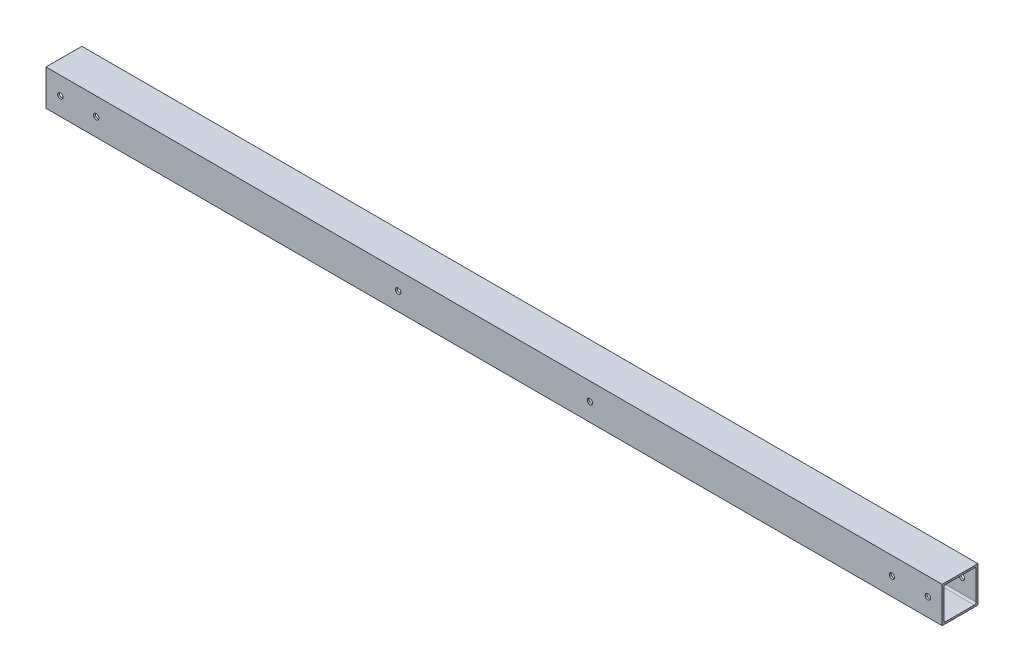
ISO-10303-21;
HEADER;
FILE_DESCRIPTION(('STEP AP214'),'2;1');
FILE_NAME('part.step','',(''),(''),'','','');
FILE_SCHEMA(('AUTOMOTIVE_DESIGN { 1 0 10303 214 1 1 1 1 }'));
ENDSEC;
DATA;
#1=APPLICATION_CONTEXT('core data for automotive mechanical design processes');
#2=APPLICATION_PROTOCOL_DEFINITION('international standard','automotive_design',2000,#1);
#3=PRODUCT_CONTEXT('',#1,'mechanical');
#4=PRODUCT('Part','Part','',(#3));
#5=PRODUCT_RELATED_PRODUCT_CATEGORY('part','',(#4));
#6=PRODUCT_DEFINITION_FORMATION('','',#4);
#7=PRODUCT_DEFINITION_CONTEXT('part definition',#1,'design');
#8=PRODUCT_DEFINITION('design','',#6,#7);
#9=PRODUCT_DEFINITION_SHAPE('','',#8);
#10=(LENGTH_UNIT() NAMED_UNIT(*) SI_UNIT(.MILLI.,.METRE.));
#11=(NAMED_UNIT(*) PLANE_ANGLE_UNIT() SI_UNIT($,.RADIAN.));
#12=(NAMED_UNIT(*) SI_UNIT($,.STERADIAN.) SOLID_ANGLE_UNIT());
#13=UNCERTAINTY_MEASURE_WITH_UNIT(LENGTH_MEASURE(1.E-05),#10,'distance_accuracy_value','');
#14=(GEOMETRIC_REPRESENTATION_CONTEXT(3) GLOBAL_UNCERTAINTY_ASSIGNED_CONTEXT((#13)) GLOBAL_UNIT_ASSIGNED_CONTEXT((#10,
#11,#12)) REPRESENTATION_CONTEXT('',''));
#15=CARTESIAN_POINT('',(0.,0.,0.));
#16=DIRECTION('',(0.,0.,1.));
#17=DIRECTION('',(1.,0.,0.));
#18=AXIS2_PLACEMENT_3D('',#15,#16,#17);
#19=CARTESIAN_POINT('',(500.,0.,0.));
#20=DIRECTION('',(-1.,0.,0.));
#21=DIRECTION('',(0.,0.,1.));
#22=AXIS2_PLACEMENT_3D('',#19,#20,#21);
#23=PLANE('',#22);
#24=DIRECTION('',(0.,1.,0.));
#25=VECTOR('',#24,1.);
#26=CARTESIAN_POINT('',(500.,-10.,-10.));
#27=LINE('',#26,#25);
#28=CARTESIAN_POINT('',(500.,-10.,-10.));
#29=VERTEX_POINT('',#28);
#30=CARTESIAN_POINT('',(500.,10.,-10.));
#31=VERTEX_POINT('',#30);
#32=EDGE_CURVE('E191',#29,#31,#27,.T.);
#33=ORIENTED_EDGE('',*,*,#32,.T.);
#34=DIRECTION('',(0.,0.,1.));
#35=VECTOR('',#34,1.);
#36=CARTESIAN_POINT('',(500.,10.,10.));
#37=LINE('',#36,#35);
#38=CARTESIAN_POINT('',(500.,10.,10.));
#39=VERTEX_POINT('',#38);
#40=EDGE_CURVE('E194',#31,#39,#37,.T.);
#41=ORIENTED_EDGE('',*,*,#40,.T.);
#42=DIRECTION('',(0.,-1.,0.));
#43=VECTOR('',#42,1.);
#44=CARTESIAN_POINT('',(500.,-10.,10.));
#45=LINE('',#44,#43);
#46=CARTESIAN_POINT('',(500.,-10.,10.));
#47=VERTEX_POINT('',#46);
#48=EDGE_CURVE('E197',#39,#47,#45,.T.);
#49=ORIENTED_EDGE('',*,*,#48,.T.);
#50=DIRECTION('',(0.,0.,-1.));
#51=VECTOR('',#50,1.);
#52=CARTESIAN_POINT('',(500.,-10.,10.));
#53=LINE('',#52,#51);
#54=EDGE_CURVE('E199',#47,#29,#53,.T.);
#55=ORIENTED_EDGE('',*,*,#54,.T.);
#56=EDGE_LOOP('',(#33,#41,#49,#55));
#57=FACE_BOUND('',#56,.T.);
#58=CARTESIAN_POINT('',(500.,-8.,8.));
#59=DIRECTION('',(1.,0.,0.));
#60=DIRECTION('',(0.,0.,1.));
#61=AXIS2_PLACEMENT_3D('',#58,#59,#60);
#62=CIRCLE('',#61,1.);
#63=CARTESIAN_POINT('',(500.,-7.99999999999999,9.));
#64=VERTEX_POINT('',#63);
#65=CARTESIAN_POINT('',(500.,-9.,7.99999999999999));
#66=VERTEX_POINT('',#65);
#67=EDGE_CURVE('E124',#64,#66,#62,.T.);
#68=ORIENTED_EDGE('',*,*,#67,.F.);
#69=DIRECTION('',(0.,-1.,0.));
#70=VECTOR('',#69,1.);
#71=CARTESIAN_POINT('',(500.,-7.99999999999999,9.));
#72=LINE('',#71,#70);
#73=CARTESIAN_POINT('',(500.,7.99999999999999,9.));
#74=VERTEX_POINT('',#73);
#75=EDGE_CURVE('E158',#74,#64,#72,.T.);
#76=ORIENTED_EDGE('',*,*,#75,.F.);
#77=CARTESIAN_POINT('',(500.,8.,8.));
#78=DIRECTION('',(1.,0.,0.));
#79=DIRECTION('',(0.,0.,1.));
#80=AXIS2_PLACEMENT_3D('',#77,#78,#79);
#81=CIRCLE('',#80,1.);
#82=CARTESIAN_POINT('',(500.,9.,7.99999999999999));
#83=VERTEX_POINT('',#82);
#84=EDGE_CURVE('E156',#83,#74,#81,.T.);
#85=ORIENTED_EDGE('',*,*,#84,.F.);
#86=DIRECTION('',(0.,0.,1.));
#87=VECTOR('',#86,1.);
#88=CARTESIAN_POINT('',(500.,9.,7.99999999999999));
#89=LINE('',#88,#87);
#90=CARTESIAN_POINT('',(500.,9.,-7.99999999999999));
#91=VERTEX_POINT('',#90);
#92=EDGE_CURVE('E154',#91,#83,#89,.T.);
#93=ORIENTED_EDGE('',*,*,#92,.F.);
#94=CARTESIAN_POINT('',(500.,8.,-8.));
#95=DIRECTION('',(1.,0.,0.));
#96=DIRECTION('',(0.,0.,1.));
#97=AXIS2_PLACEMENT_3D('',#94,#95,#96);
#98=CIRCLE('',#97,1.);
#99=CARTESIAN_POINT('',(500.,7.99999999999999,-9.));
#100=VERTEX_POINT('',#99);
#101=EDGE_CURVE('E152',#100,#91,#98,.T.);
#102=ORIENTED_EDGE('',*,*,#101,.F.);
#103=DIRECTION('',(0.,1.,0.));
#104=VECTOR('',#103,1.);
#105=CARTESIAN_POINT('',(500.,-7.99999999999999,-9.));
#106=LINE('',#105,#104);
#107=CARTESIAN_POINT('',(500.,-8.,-9.));
#108=VERTEX_POINT('',#107);
#109=EDGE_CURVE('E147',#108,#100,#106,.T.);
#110=ORIENTED_EDGE('',*,*,#109,.F.);
#111=CARTESIAN_POINT('',(500.,-8.,-8.));
#112=DIRECTION('',(1.,0.,0.));
#113=DIRECTION('',(0.,0.,-1.));
#114=AXIS2_PLACEMENT_3D('',#111,#112,#113);
#115=CIRCLE('',#114,1.);
#116=CARTESIAN_POINT('',(500.,-9.,-7.99999999999999));
#117=VERTEX_POINT('',#116);
#118=EDGE_CURVE('E145',#117,#108,#115,.T.);
#119=ORIENTED_EDGE('',*,*,#118,.F.);
#120=DIRECTION('',(0.,0.,-1.));
#121=VECTOR('',#120,1.);
#122=CARTESIAN_POINT('',(500.,-9.,7.99999999999999));
#123=LINE('',#122,#121);
#124=EDGE_CURVE('E132',#66,#117,#123,.T.);
#125=ORIENTED_EDGE('',*,*,#124,.F.);
#126=EDGE_LOOP('',(#68,#76,#85,#93,#102,#110,#119,#125));
#127=FACE_BOUND('',#126,.T.);
#128=ADVANCED_FACE('F33',(#57,#127),#23,.F.);
#129=CARTESIAN_POINT('',(0.,0.,0.));
#130=DIRECTION('',(-1.,0.,0.));
#131=DIRECTION('',(0.,0.,1.));
#132=AXIS2_PLACEMENT_3D('',#129,#130,#131);
#133=PLANE('',#132);
#134=DIRECTION('',(0.,1.,0.));
#135=VECTOR('',#134,1.);
#136=CARTESIAN_POINT('',(0.,-10.,-10.));
#137=LINE('',#136,#135);
#138=CARTESIAN_POINT('',(0.,-10.,-10.));
#139=VERTEX_POINT('',#138);
#140=CARTESIAN_POINT('',(0.,10.,-10.));
#141=VERTEX_POINT('',#140);
#142=EDGE_CURVE('E140',#139,#141,#137,.T.);
#143=ORIENTED_EDGE('',*,*,#142,.F.);
#144=DIRECTION('',(0.,0.,-1.));
#145=VECTOR('',#144,1.);
#146=CARTESIAN_POINT('',(0.,-10.,10.));
#147=LINE('',#146,#145);
#148=CARTESIAN_POINT('',(0.,-10.,10.));
#149=VERTEX_POINT('',#148);
#150=EDGE_CURVE('E195',#149,#139,#147,.T.);
#151=ORIENTED_EDGE('',*,*,#150,.F.);
#152=DIRECTION('',(0.,-1.,0.));
#153=VECTOR('',#152,1.);
#154=CARTESIAN_POINT('',(0.,-10.,10.));
#155=LINE('',#154,#153);
#156=CARTESIAN_POINT('',(0.,10.,10.));
#157=VERTEX_POINT('',#156);
#158=EDGE_CURVE('E206',#157,#149,#155,.T.);
#159=ORIENTED_EDGE('',*,*,#158,.F.);
#160=DIRECTION('',(0.,0.,1.));
#161=VECTOR('',#160,1.);
#162=CARTESIAN_POINT('',(0.,10.,10.));
#163=LINE('',#162,#161);
#164=EDGE_CURVE('E204',#141,#157,#163,.T.);
#165=ORIENTED_EDGE('',*,*,#164,.F.);
#166=EDGE_LOOP('',(#143,#151,#159,#165));
#167=FACE_BOUND('',#166,.T.);
#168=DIRECTION('',(0.,-1.,0.));
#169=VECTOR('',#168,1.);
#170=CARTESIAN_POINT('',(0.,-7.99999999999999,9.));
#171=LINE('',#170,#169);
#172=CARTESIAN_POINT('',(0.,7.99999999999999,9.));
#173=VERTEX_POINT('',#172);
#174=CARTESIAN_POINT('',(0.,-7.99999999999999,9.));
#175=VERTEX_POINT('',#174);
#176=EDGE_CURVE('E133',#173,#175,#171,.T.);
#177=ORIENTED_EDGE('',*,*,#176,.T.);
#178=CARTESIAN_POINT('',(0.,-8.,8.));
#179=DIRECTION('',(1.,0.,0.));
#180=DIRECTION('',(0.,0.,1.));
#181=AXIS2_PLACEMENT_3D('',#178,#179,#180);
#182=CIRCLE('',#181,1.);
#183=CARTESIAN_POINT('',(0.,-9.,7.99999999999999));
#184=VERTEX_POINT('',#183);
#185=EDGE_CURVE('E58',#175,#184,#182,.T.);
#186=ORIENTED_EDGE('',*,*,#185,.T.);
#187=DIRECTION('',(0.,0.,-1.));
#188=VECTOR('',#187,1.);
#189=CARTESIAN_POINT('',(0.,-9.,7.99999999999999));
#190=LINE('',#189,#188);
#191=CARTESIAN_POINT('',(0.,-9.,-7.99999999999999));
#192=VERTEX_POINT('',#191);
#193=EDGE_CURVE('E139',#184,#192,#190,.T.);
#194=ORIENTED_EDGE('',*,*,#193,.T.);
#195=CARTESIAN_POINT('',(0.,-8.,-8.));
#196=DIRECTION('',(1.,0.,0.));
#197=DIRECTION('',(0.,0.,-1.));
#198=AXIS2_PLACEMENT_3D('',#195,#196,#197);
#199=CIRCLE('',#198,1.);
#200=CARTESIAN_POINT('',(0.,-8.,-9.));
#201=VERTEX_POINT('',#200);
#202=EDGE_CURVE('E163',#192,#201,#199,.T.);
#203=ORIENTED_EDGE('',*,*,#202,.T.);
#204=DIRECTION('',(0.,1.,0.));
#205=VECTOR('',#204,1.);
#206=CARTESIAN_POINT('',(0.,-7.99999999999999,-9.));
#207=LINE('',#206,#205);
#208=CARTESIAN_POINT('',(0.,7.99999999999999,-9.));
#209=VERTEX_POINT('',#208);
#210=EDGE_CURVE('E166',#201,#209,#207,.T.);
#211=ORIENTED_EDGE('',*,*,#210,.T.);
#212=CARTESIAN_POINT('',(0.,8.,-8.));
#213=DIRECTION('',(1.,0.,0.));
#214=DIRECTION('',(0.,0.,1.));
#215=AXIS2_PLACEMENT_3D('',#212,#213,#214);
#216=CIRCLE('',#215,1.);
#217=CARTESIAN_POINT('',(0.,9.,-7.99999999999999));
#218=VERTEX_POINT('',#217);
#219=EDGE_CURVE('E169',#209,#218,#216,.T.);
#220=ORIENTED_EDGE('',*,*,#219,.T.);
#221=DIRECTION('',(0.,0.,1.));
#222=VECTOR('',#221,1.);
#223=CARTESIAN_POINT('',(0.,9.,7.99999999999999));
#224=LINE('',#223,#222);
#225=CARTESIAN_POINT('',(0.,9.,7.99999999999999));
#226=VERTEX_POINT('',#225);
#227=EDGE_CURVE('E172',#218,#226,#224,.T.);
#228=ORIENTED_EDGE('',*,*,#227,.T.);
#229=CARTESIAN_POINT('',(0.,8.,8.));
#230=DIRECTION('',(1.,0.,0.));
#231=DIRECTION('',(0.,0.,1.));
#232=AXIS2_PLACEMENT_3D('',#229,#230,#231);
#233=CIRCLE('',#232,1.);
#234=EDGE_CURVE('E175',#226,#173,#233,.T.);
#235=ORIENTED_EDGE('',*,*,#234,.T.);
#236=EDGE_LOOP('',(#177,#186,#194,#203,#211,#220,#228,#235));
#237=FACE_BOUND('',#236,.T.);
#238=ADVANCED_FACE('F300',(#167,#237),#133,.T.);
#239=CARTESIAN_POINT('',(500.,-10.,-10.));
#240=DIRECTION('',(0.,0.,1.));
#241=DIRECTION('',(1.,0.,0.));
#242=AXIS2_PLACEMENT_3D('',#239,#240,#241);
#243=PLANE('',#242);
#244=CARTESIAN_POINT('',(303.5,0.,-10.));
#245=DIRECTION('',(0.,0.,1.));
#246=DIRECTION('',(1.,0.,0.));
#247=AXIS2_PLACEMENT_3D('',#244,#245,#246);
#248=CIRCLE('',#247,1.50000000000002);
#249=CARTESIAN_POINT('',(305.,0.,-10.));
#250=VERTEX_POINT('',#249);
#251=EDGE_CURVE('E432',#250,#250,#248,.T.);
#252=ORIENTED_EDGE('',*,*,#251,.T.);
#253=EDGE_LOOP('',(#252));
#254=FACE_BOUND('',#253,.T.);
#255=CARTESIAN_POINT('',(196.5,0.,-10.));
#256=DIRECTION('',(0.,0.,1.));
#257=DIRECTION('',(1.,0.,0.));
#258=AXIS2_PLACEMENT_3D('',#255,#256,#257);
#259=CIRCLE('',#258,1.5);
#260=CARTESIAN_POINT('',(198.,0.,-10.));
#261=VERTEX_POINT('',#260);
#262=EDGE_CURVE('E238',#261,#261,#259,.T.);
#263=ORIENTED_EDGE('',*,*,#262,.T.);
#264=EDGE_LOOP('',(#263));
#265=FACE_BOUND('',#264,.T.);
#266=CARTESIAN_POINT('',(472.,0.,-10.));
#267=DIRECTION('',(0.,0.,1.));
#268=DIRECTION('',(1.,0.,0.));
#269=AXIS2_PLACEMENT_3D('',#266,#267,#268);
#270=CIRCLE('',#269,1.49999999999997);
#271=CARTESIAN_POINT('',(473.5,0.,-10.));
#272=VERTEX_POINT('',#271);
#273=EDGE_CURVE('E258',#272,#272,#270,.T.);
#274=ORIENTED_EDGE('',*,*,#273,.T.);
#275=EDGE_LOOP('',(#274));
#276=FACE_BOUND('',#275,.T.);
#277=CARTESIAN_POINT('',(492.,0.,-10.));
#278=DIRECTION('',(0.,0.,1.));
#279=DIRECTION('',(1.,0.,0.));
#280=AXIS2_PLACEMENT_3D('',#277,#278,#279);
#281=CIRCLE('',#280,1.49999999999997);
#282=CARTESIAN_POINT('',(493.5,0.,-10.));
#283=VERTEX_POINT('',#282);
#284=EDGE_CURVE('E265',#283,#283,#281,.T.);
#285=ORIENTED_EDGE('',*,*,#284,.T.);
#286=EDGE_LOOP('',(#285));
#287=FACE_BOUND('',#286,.T.);
#288=CARTESIAN_POINT('',(28.,0.,-10.));
#289=DIRECTION('',(0.,0.,1.));
#290=DIRECTION('',(1.,0.,0.));
#291=AXIS2_PLACEMENT_3D('',#288,#289,#290);
#292=CIRCLE('',#291,1.5);
#293=CARTESIAN_POINT('',(29.5,0.,-10.));
#294=VERTEX_POINT('',#293);
#295=EDGE_CURVE('E272',#294,#294,#292,.T.);
#296=ORIENTED_EDGE('',*,*,#295,.T.);
#297=EDGE_LOOP('',(#296));
#298=FACE_BOUND('',#297,.T.);
#299=CARTESIAN_POINT('',(8.,0.,-10.));
#300=DIRECTION('',(0.,0.,1.));
#301=DIRECTION('',(1.,0.,0.));
#302=AXIS2_PLACEMENT_3D('',#299,#300,#301);
#303=CIRCLE('',#302,1.5);
#304=CARTESIAN_POINT('',(9.5,0.,-10.));
#305=VERTEX_POINT('',#304);
#306=EDGE_CURVE('E161',#305,#305,#303,.T.);
#307=ORIENTED_EDGE('',*,*,#306,.T.);
#308=EDGE_LOOP('',(#307));
#309=FACE_BOUND('',#308,.T.);
#310=ORIENTED_EDGE('',*,*,#142,.T.);
#311=DIRECTION('',(-1.,0.,0.));
#312=VECTOR('',#311,1.);
#313=CARTESIAN_POINT('',(500.,10.,-10.));
#314=LINE('',#313,#312);
#315=EDGE_CURVE('E11',#31,#141,#314,.T.);
#316=ORIENTED_EDGE('',*,*,#315,.F.);
#317=ORIENTED_EDGE('',*,*,#32,.F.);
#318=DIRECTION('',(-1.,0.,0.));
#319=VECTOR('',#318,1.);
#320=CARTESIAN_POINT('',(500.,-10.,-10.));
#321=LINE('',#320,#319);
#322=EDGE_CURVE('E201',#29,#139,#321,.T.);
#323=ORIENTED_EDGE('',*,*,#322,.T.);
#324=EDGE_LOOP('',(#310,#316,#317,#323));
#325=FACE_BOUND('',#324,.T.);
#326=ADVANCED_FACE('F35',(#254,#265,#276,#287,#298,#309,#325),#243,.F.);
#327=CARTESIAN_POINT('',(500.,10.,10.));
#328=DIRECTION('',(0.,-1.,0.));
#329=DIRECTION('',(0.,0.,-1.));
#330=AXIS2_PLACEMENT_3D('',#327,#328,#329);
#331=PLANE('',#330);
#332=ORIENTED_EDGE('',*,*,#164,.T.);
#333=DIRECTION('',(-1.,0.,0.));
#334=VECTOR('',#333,1.);
#335=CARTESIAN_POINT('',(500.,10.,10.));
#336=LINE('',#335,#334);
#337=EDGE_CURVE('E42',#39,#157,#336,.T.);
#338=ORIENTED_EDGE('',*,*,#337,.F.);
#339=ORIENTED_EDGE('',*,*,#40,.F.);
#340=ORIENTED_EDGE('',*,*,#315,.T.);
#341=EDGE_LOOP('',(#332,#338,#339,#340));
#342=FACE_BOUND('',#341,.T.);
#343=ADVANCED_FACE('F317',(#342),#331,.F.);
#344=CARTESIAN_POINT('',(500.,-10.,10.));
#345=DIRECTION('',(0.,0.,-1.));
#346=DIRECTION('',(-1.,0.,0.));
#347=AXIS2_PLACEMENT_3D('',#344,#345,#346);
#348=PLANE('',#347);
#349=CARTESIAN_POINT('',(303.5,0.,10.));
#350=DIRECTION('',(0.,0.,1.));
#351=DIRECTION('',(1.,0.,0.));
#352=AXIS2_PLACEMENT_3D('',#349,#350,#351);
#353=CIRCLE('',#352,1.50000000000002);
#354=CARTESIAN_POINT('',(305.,0.,10.));
#355=VERTEX_POINT('',#354);
#356=EDGE_CURVE('E431',#355,#355,#353,.T.);
#357=ORIENTED_EDGE('',*,*,#356,.F.);
#358=EDGE_LOOP('',(#357));
#359=FACE_BOUND('',#358,.T.);
#360=CARTESIAN_POINT('',(196.5,0.,10.));
#361=DIRECTION('',(0.,0.,1.));
#362=DIRECTION('',(1.,0.,0.));
#363=AXIS2_PLACEMENT_3D('',#360,#361,#362);
#364=CIRCLE('',#363,1.5);
#365=CARTESIAN_POINT('',(198.,0.,10.));
#366=VERTEX_POINT('',#365);
#367=EDGE_CURVE('E244',#366,#366,#364,.T.);
#368=ORIENTED_EDGE('',*,*,#367,.F.);
#369=EDGE_LOOP('',(#368));
#370=FACE_BOUND('',#369,.T.);
#371=CARTESIAN_POINT('',(472.,0.,10.));
#372=DIRECTION('',(0.,0.,1.));
#373=DIRECTION('',(1.,0.,0.));
#374=AXIS2_PLACEMENT_3D('',#371,#372,#373);
#375=CIRCLE('',#374,1.49999999999997);
#376=CARTESIAN_POINT('',(473.5,0.,10.));
#377=VERTEX_POINT('',#376);
#378=EDGE_CURVE('E234',#377,#377,#375,.T.);
#379=ORIENTED_EDGE('',*,*,#378,.F.);
#380=EDGE_LOOP('',(#379));
#381=FACE_BOUND('',#380,.T.);
#382=CARTESIAN_POINT('',(492.,0.,10.));
#383=DIRECTION('',(0.,0.,1.));
#384=DIRECTION('',(1.,0.,0.));
#385=AXIS2_PLACEMENT_3D('',#382,#383,#384);
#386=CIRCLE('',#385,1.49999999999997);
#387=CARTESIAN_POINT('',(493.5,0.,10.));
#388=VERTEX_POINT('',#387);
#389=EDGE_CURVE('E230',#388,#388,#386,.T.);
#390=ORIENTED_EDGE('',*,*,#389,.F.);
#391=EDGE_LOOP('',(#390));
#392=FACE_BOUND('',#391,.T.);
#393=CARTESIAN_POINT('',(28.,0.,10.));
#394=DIRECTION('',(0.,0.,1.));
#395=DIRECTION('',(1.,0.,0.));
#396=AXIS2_PLACEMENT_3D('',#393,#394,#395);
#397=CIRCLE('',#396,1.5);
#398=CARTESIAN_POINT('',(29.5,0.,10.));
#399=VERTEX_POINT('',#398);
#400=EDGE_CURVE('E225',#399,#399,#397,.T.);
#401=ORIENTED_EDGE('',*,*,#400,.F.);
#402=EDGE_LOOP('',(#401));
#403=FACE_BOUND('',#402,.T.);
#404=CARTESIAN_POINT('',(8.,0.,10.));
#405=DIRECTION('',(0.,0.,1.));
#406=DIRECTION('',(1.,0.,0.));
#407=AXIS2_PLACEMENT_3D('',#404,#405,#406);
#408=CIRCLE('',#407,1.5);
#409=CARTESIAN_POINT('',(9.5,0.,10.));
#410=VERTEX_POINT('',#409);
#411=EDGE_CURVE('E220',#410,#410,#408,.T.);
#412=ORIENTED_EDGE('',*,*,#411,.F.);
#413=EDGE_LOOP('',(#412));
#414=FACE_BOUND('',#413,.T.);
#415=ORIENTED_EDGE('',*,*,#158,.T.);
#416=DIRECTION('',(-1.,0.,0.));
#417=VECTOR('',#416,1.);
#418=CARTESIAN_POINT('',(500.,-10.,10.));
#419=LINE('',#418,#417);
#420=EDGE_CURVE('E211',#47,#149,#419,.T.);
#421=ORIENTED_EDGE('',*,*,#420,.F.);
#422=ORIENTED_EDGE('',*,*,#48,.F.);
#423=ORIENTED_EDGE('',*,*,#337,.T.);
#424=EDGE_LOOP('',(#415,#421,#422,#423));
#425=FACE_BOUND('',#424,.T.);
#426=ADVANCED_FACE('F314',(#359,#370,#381,#392,#403,#414,#425),#348,.F.);
#427=CARTESIAN_POINT('',(500.,-10.,10.));
#428=DIRECTION('',(0.,1.,0.));
#429=DIRECTION('',(0.,0.,1.));
#430=AXIS2_PLACEMENT_3D('',#427,#428,#429);
#431=PLANE('',#430);
#432=ORIENTED_EDGE('',*,*,#150,.T.);
#433=ORIENTED_EDGE('',*,*,#322,.F.);
#434=ORIENTED_EDGE('',*,*,#54,.F.);
#435=ORIENTED_EDGE('',*,*,#420,.T.);
#436=EDGE_LOOP('',(#432,#433,#434,#435));
#437=FACE_BOUND('',#436,.T.);
#438=ADVANCED_FACE('F311',(#437),#431,.F.);
#439=CARTESIAN_POINT('',(500.,-8.,8.));
#440=DIRECTION('',(-1.,0.,0.));
#441=DIRECTION('',(0.,0.,1.));
#442=AXIS2_PLACEMENT_3D('',#439,#440,#441);
#443=CYLINDRICAL_SURFACE('',#442,1.);
#444=ORIENTED_EDGE('',*,*,#185,.F.);
#445=DIRECTION('',(-1.,0.,0.));
#446=VECTOR('',#445,1.);
#447=CARTESIAN_POINT('',(500.,-7.99999999999999,9.));
#448=LINE('',#447,#446);
#449=EDGE_CURVE('E128',#64,#175,#448,.T.);
#450=ORIENTED_EDGE('',*,*,#449,.F.);
#451=ORIENTED_EDGE('',*,*,#67,.T.);
#452=DIRECTION('',(-1.,0.,0.));
#453=VECTOR('',#452,1.);
#454=CARTESIAN_POINT('',(500.,-9.,7.99999999999999));
#455=LINE('',#454,#453);
#456=EDGE_CURVE('E127',#66,#184,#455,.T.);
#457=ORIENTED_EDGE('',*,*,#456,.T.);
#458=EDGE_LOOP('',(#444,#450,#451,#457));
#459=FACE_BOUND('',#458,.T.);
#460=ADVANCED_FACE('F126',(#459),#443,.F.);
#461=CARTESIAN_POINT('',(500.,-9.,7.99999999999999));
#462=DIRECTION('',(0.,1.,0.));
#463=DIRECTION('',(0.,0.,1.));
#464=AXIS2_PLACEMENT_3D('',#461,#462,#463);
#465=PLANE('',#464);
#466=ORIENTED_EDGE('',*,*,#193,.F.);
#467=ORIENTED_EDGE('',*,*,#456,.F.);
#468=ORIENTED_EDGE('',*,*,#124,.T.);
#469=DIRECTION('',(-1.,0.,0.));
#470=VECTOR('',#469,1.);
#471=CARTESIAN_POINT('',(500.,-9.,-7.99999999999999));
#472=LINE('',#471,#470);
#473=EDGE_CURVE('E141',#117,#192,#472,.T.);
#474=ORIENTED_EDGE('',*,*,#473,.T.);
#475=EDGE_LOOP('',(#466,#467,#468,#474));
#476=FACE_BOUND('',#475,.T.);
#477=ADVANCED_FACE('F136',(#476),#465,.T.);
#478=CARTESIAN_POINT('',(500.,-8.,-8.));
#479=DIRECTION('',(-1.,0.,0.));
#480=DIRECTION('',(0.,0.,1.));
#481=AXIS2_PLACEMENT_3D('',#478,#479,#480);
#482=CYLINDRICAL_SURFACE('',#481,1.);
#483=ORIENTED_EDGE('',*,*,#202,.F.);
#484=ORIENTED_EDGE('',*,*,#473,.F.);
#485=ORIENTED_EDGE('',*,*,#118,.T.);
#486=DIRECTION('',(-1.,0.,0.));
#487=VECTOR('',#486,1.);
#488=CARTESIAN_POINT('',(500.,-8.,-9.));
#489=LINE('',#488,#487);
#490=EDGE_CURVE('E188',#108,#201,#489,.T.);
#491=ORIENTED_EDGE('',*,*,#490,.T.);
#492=EDGE_LOOP('',(#483,#484,#485,#491));
#493=FACE_BOUND('',#492,.T.);
#494=ADVANCED_FACE('F358',(#493),#482,.F.);
#495=CARTESIAN_POINT('',(500.,-7.99999999999999,-9.));
#496=DIRECTION('',(0.,0.,1.));
#497=DIRECTION('',(0.,-1.,0.));
#498=AXIS2_PLACEMENT_3D('',#495,#496,#497);
#499=PLANE('',#498);
#500=CARTESIAN_POINT('',(303.5,0.,-9.));
#501=DIRECTION('',(0.,0.,1.));
#502=DIRECTION('',(0.,-1.,0.));
#503=AXIS2_PLACEMENT_3D('',#500,#501,#502);
#504=CIRCLE('',#503,1.50000000000002);
#505=CARTESIAN_POINT('',(303.5,-1.50000000000002,-9.));
#506=VERTEX_POINT('',#505);
#507=EDGE_CURVE('E249',#506,#506,#504,.T.);
#508=ORIENTED_EDGE('',*,*,#507,.F.);
#509=EDGE_LOOP('',(#508));
#510=FACE_BOUND('',#509,.T.);
#511=CARTESIAN_POINT('',(196.5,0.,-9.));
#512=DIRECTION('',(0.,0.,1.));
#513=DIRECTION('',(0.,-1.,0.));
#514=AXIS2_PLACEMENT_3D('',#511,#512,#513);
#515=CIRCLE('',#514,1.5);
#516=CARTESIAN_POINT('',(196.5,-1.5,-9.));
#517=VERTEX_POINT('',#516);
#518=EDGE_CURVE('E237',#517,#517,#515,.T.);
#519=ORIENTED_EDGE('',*,*,#518,.F.);
#520=EDGE_LOOP('',(#519));
#521=FACE_BOUND('',#520,.T.);
#522=CARTESIAN_POINT('',(472.,0.,-9.));
#523=DIRECTION('',(0.,0.,1.));
#524=DIRECTION('',(0.,-1.,0.));
#525=AXIS2_PLACEMENT_3D('',#522,#523,#524);
#526=CIRCLE('',#525,1.49999999999997);
#527=CARTESIAN_POINT('',(472.,-1.49999999999997,-9.));
#528=VERTEX_POINT('',#527);
#529=EDGE_CURVE('E233',#528,#528,#526,.T.);
#530=ORIENTED_EDGE('',*,*,#529,.F.);
#531=EDGE_LOOP('',(#530));
#532=FACE_BOUND('',#531,.T.);
#533=CARTESIAN_POINT('',(492.,0.,-9.));
#534=DIRECTION('',(0.,0.,1.));
#535=DIRECTION('',(0.,-1.,0.));
#536=AXIS2_PLACEMENT_3D('',#533,#534,#535);
#537=CIRCLE('',#536,1.49999999999997);
#538=CARTESIAN_POINT('',(492.,-1.49999999999997,-9.));
#539=VERTEX_POINT('',#538);
#540=EDGE_CURVE('E229',#539,#539,#537,.T.);
#541=ORIENTED_EDGE('',*,*,#540,.F.);
#542=EDGE_LOOP('',(#541));
#543=FACE_BOUND('',#542,.T.);
#544=CARTESIAN_POINT('',(28.,0.,-9.00000000000001));
#545=DIRECTION('',(0.,0.,1.));
#546=DIRECTION('',(0.,-1.,0.));
#547=AXIS2_PLACEMENT_3D('',#544,#545,#546);
#548=CIRCLE('',#547,1.5);
#549=CARTESIAN_POINT('',(28.,-1.5,-9.00000000000001));
#550=VERTEX_POINT('',#549);
#551=EDGE_CURVE('E224',#550,#550,#548,.T.);
#552=ORIENTED_EDGE('',*,*,#551,.F.);
#553=EDGE_LOOP('',(#552));
#554=FACE_BOUND('',#553,.T.);
#555=CARTESIAN_POINT('',(8.,0.,-9.00000000000001));
#556=DIRECTION('',(0.,0.,1.));
#557=DIRECTION('',(0.,-1.,0.));
#558=AXIS2_PLACEMENT_3D('',#555,#556,#557);
#559=CIRCLE('',#558,1.5);
#560=CARTESIAN_POINT('',(8.,-1.5,-9.00000000000001));
#561=VERTEX_POINT('',#560);
#562=EDGE_CURVE('E219',#561,#561,#559,.T.);
#563=ORIENTED_EDGE('',*,*,#562,.F.);
#564=EDGE_LOOP('',(#563));
#565=FACE_BOUND('',#564,.T.);
#566=ORIENTED_EDGE('',*,*,#210,.F.);
#567=ORIENTED_EDGE('',*,*,#490,.F.);
#568=ORIENTED_EDGE('',*,*,#109,.T.);
#569=DIRECTION('',(-1.,0.,0.));
#570=VECTOR('',#569,1.);
#571=CARTESIAN_POINT('',(500.,7.99999999999999,-9.));
#572=LINE('',#571,#570);
#573=EDGE_CURVE('E186',#100,#209,#572,.T.);
#574=ORIENTED_EDGE('',*,*,#573,.T.);
#575=EDGE_LOOP('',(#566,#567,#568,#574));
#576=FACE_BOUND('',#575,.T.);
#577=ADVANCED_FACE('F355',(#510,#521,#532,#543,#554,#565,#576),#499,.T.);
#578=CARTESIAN_POINT('',(500.,8.,-8.));
#579=DIRECTION('',(-1.,0.,0.));
#580=DIRECTION('',(0.,0.,1.));
#581=AXIS2_PLACEMENT_3D('',#578,#579,#580);
#582=CYLINDRICAL_SURFACE('',#581,1.);
#583=ORIENTED_EDGE('',*,*,#219,.F.);
#584=ORIENTED_EDGE('',*,*,#573,.F.);
#585=ORIENTED_EDGE('',*,*,#101,.T.);
#586=DIRECTION('',(-1.,0.,0.));
#587=VECTOR('',#586,1.);
#588=CARTESIAN_POINT('',(500.,9.,-7.99999999999999));
#589=LINE('',#588,#587);
#590=EDGE_CURVE('E184',#91,#218,#589,.T.);
#591=ORIENTED_EDGE('',*,*,#590,.T.);
#592=EDGE_LOOP('',(#583,#584,#585,#591));
#593=FACE_BOUND('',#592,.T.);
#594=ADVANCED_FACE('F350',(#593),#582,.F.);
#595=CARTESIAN_POINT('',(500.,9.,7.99999999999999));
#596=DIRECTION('',(0.,-1.,0.));
#597=DIRECTION('',(0.,0.,-1.));
#598=AXIS2_PLACEMENT_3D('',#595,#596,#597);
#599=PLANE('',#598);
#600=ORIENTED_EDGE('',*,*,#227,.F.);
#601=ORIENTED_EDGE('',*,*,#590,.F.);
#602=ORIENTED_EDGE('',*,*,#92,.T.);
#603=DIRECTION('',(-1.,0.,0.));
#604=VECTOR('',#603,1.);
#605=CARTESIAN_POINT('',(500.,9.,7.99999999999999));
#606=LINE('',#605,#604);
#607=EDGE_CURVE('E182',#83,#226,#606,.T.);
#608=ORIENTED_EDGE('',*,*,#607,.T.);
#609=EDGE_LOOP('',(#600,#601,#602,#608));
#610=FACE_BOUND('',#609,.T.);
#611=ADVANCED_FACE('F346',(#610),#599,.T.);
#612=CARTESIAN_POINT('',(500.,8.,8.));
#613=DIRECTION('',(-1.,0.,0.));
#614=DIRECTION('',(0.,0.,1.));
#615=AXIS2_PLACEMENT_3D('',#612,#613,#614);
#616=CYLINDRICAL_SURFACE('',#615,1.);
#617=ORIENTED_EDGE('',*,*,#234,.F.);
#618=ORIENTED_EDGE('',*,*,#607,.F.);
#619=ORIENTED_EDGE('',*,*,#84,.T.);
#620=DIRECTION('',(-1.,0.,0.));
#621=VECTOR('',#620,1.);
#622=CARTESIAN_POINT('',(500.,7.99999999999999,9.));
#623=LINE('',#622,#621);
#624=EDGE_CURVE('E50',#74,#173,#623,.T.);
#625=ORIENTED_EDGE('',*,*,#624,.T.);
#626=EDGE_LOOP('',(#617,#618,#619,#625));
#627=FACE_BOUND('',#626,.T.);
#628=ADVANCED_FACE('F343',(#627),#616,.F.);
#629=CARTESIAN_POINT('',(500.,-7.99999999999999,9.));
#630=DIRECTION('',(0.,0.,-1.));
#631=DIRECTION('',(-1.,0.,0.));
#632=AXIS2_PLACEMENT_3D('',#629,#630,#631);
#633=PLANE('',#632);
#634=CARTESIAN_POINT('',(303.5,0.,9.));
#635=DIRECTION('',(0.,0.,-1.));
#636=DIRECTION('',(-1.,0.,0.));
#637=AXIS2_PLACEMENT_3D('',#634,#635,#636);
#638=CIRCLE('',#637,1.50000000000002);
#639=CARTESIAN_POINT('',(302.,0.,9.));
#640=VERTEX_POINT('',#639);
#641=EDGE_CURVE('E37',#640,#640,#638,.T.);
#642=ORIENTED_EDGE('',*,*,#641,.F.);
#643=EDGE_LOOP('',(#642));
#644=FACE_BOUND('',#643,.T.);
#645=CARTESIAN_POINT('',(196.5,0.,9.));
#646=DIRECTION('',(0.,0.,-1.));
#647=DIRECTION('',(-1.,0.,0.));
#648=AXIS2_PLACEMENT_3D('',#645,#646,#647);
#649=CIRCLE('',#648,1.5);
#650=CARTESIAN_POINT('',(195.,0.,9.));
#651=VERTEX_POINT('',#650);
#652=EDGE_CURVE('E235',#651,#651,#649,.T.);
#653=ORIENTED_EDGE('',*,*,#652,.F.);
#654=EDGE_LOOP('',(#653));
#655=FACE_BOUND('',#654,.T.);
#656=CARTESIAN_POINT('',(472.,0.,9.));
#657=DIRECTION('',(0.,0.,-1.));
#658=DIRECTION('',(-1.,0.,0.));
#659=AXIS2_PLACEMENT_3D('',#656,#657,#658);
#660=CIRCLE('',#659,1.49999999999997);
#661=CARTESIAN_POINT('',(470.5,0.,9.));
#662=VERTEX_POINT('',#661);
#663=EDGE_CURVE('E231',#662,#662,#660,.T.);
#664=ORIENTED_EDGE('',*,*,#663,.F.);
#665=EDGE_LOOP('',(#664));
#666=FACE_BOUND('',#665,.T.);
#667=CARTESIAN_POINT('',(492.,0.,9.));
#668=DIRECTION('',(0.,0.,-1.));
#669=DIRECTION('',(-1.,0.,0.));
#670=AXIS2_PLACEMENT_3D('',#667,#668,#669);
#671=CIRCLE('',#670,1.49999999999997);
#672=CARTESIAN_POINT('',(490.5,0.,9.));
#673=VERTEX_POINT('',#672);
#674=EDGE_CURVE('E226',#673,#673,#671,.T.);
#675=ORIENTED_EDGE('',*,*,#674,.F.);
#676=EDGE_LOOP('',(#675));
#677=FACE_BOUND('',#676,.T.);
#678=CARTESIAN_POINT('',(28.,0.,9.00000000000001));
#679=DIRECTION('',(0.,0.,-1.));
#680=DIRECTION('',(-1.,0.,0.));
#681=AXIS2_PLACEMENT_3D('',#678,#679,#680);
#682=CIRCLE('',#681,1.5);
#683=CARTESIAN_POINT('',(26.5,0.,9.00000000000001));
#684=VERTEX_POINT('',#683);
#685=EDGE_CURVE('E221',#684,#684,#682,.T.);
#686=ORIENTED_EDGE('',*,*,#685,.F.);
#687=EDGE_LOOP('',(#686));
#688=FACE_BOUND('',#687,.T.);
#689=CARTESIAN_POINT('',(8.,0.,9.00000000000001));
#690=DIRECTION('',(0.,0.,-1.));
#691=DIRECTION('',(-1.,0.,0.));
#692=AXIS2_PLACEMENT_3D('',#689,#690,#691);
#693=CIRCLE('',#692,1.5);
#694=CARTESIAN_POINT('',(6.5,0.,9.00000000000001));
#695=VERTEX_POINT('',#694);
#696=EDGE_CURVE('E216',#695,#695,#693,.T.);
#697=ORIENTED_EDGE('',*,*,#696,.F.);
#698=EDGE_LOOP('',(#697));
#699=FACE_BOUND('',#698,.T.);
#700=ORIENTED_EDGE('',*,*,#176,.F.);
#701=ORIENTED_EDGE('',*,*,#624,.F.);
#702=ORIENTED_EDGE('',*,*,#75,.T.);
#703=ORIENTED_EDGE('',*,*,#449,.T.);
#704=EDGE_LOOP('',(#700,#701,#702,#703));
#705=FACE_BOUND('',#704,.T.);
#706=ADVANCED_FACE('F296',(#644,#655,#666,#677,#688,#699,#705),#633,.T.);
#707=CARTESIAN_POINT('',(8.,0.,-590.));
#708=DIRECTION('',(0.,0.,1.));
#709=DIRECTION('',(1.,0.,0.));
#710=AXIS2_PLACEMENT_3D('',#707,#708,#709);
#711=CYLINDRICAL_SURFACE('',#710,1.5);
#712=ORIENTED_EDGE('',*,*,#696,.T.);
#713=EDGE_LOOP('',(#712));
#714=FACE_BOUND('',#713,.T.);
#715=ORIENTED_EDGE('',*,*,#411,.T.);
#716=EDGE_LOOP('',(#715));
#717=FACE_BOUND('',#716,.T.);
#718=ADVANCED_FACE('F286',(#714,#717),#711,.F.);
#719=ORIENTED_EDGE('',*,*,#562,.T.);
#720=EDGE_LOOP('',(#719));
#721=FACE_BOUND('',#720,.T.);
#722=ORIENTED_EDGE('',*,*,#306,.F.);
#723=EDGE_LOOP('',(#722));
#724=FACE_BOUND('',#723,.T.);
#725=ADVANCED_FACE('F283',(#721,#724),#711,.F.);
#726=CARTESIAN_POINT('',(28.,0.,-590.));
#727=DIRECTION('',(0.,0.,1.));
#728=DIRECTION('',(1.,0.,0.));
#729=AXIS2_PLACEMENT_3D('',#726,#727,#728);
#730=CYLINDRICAL_SURFACE('',#729,1.5);
#731=ORIENTED_EDGE('',*,*,#685,.T.);
#732=EDGE_LOOP('',(#731));
#733=FACE_BOUND('',#732,.T.);
#734=ORIENTED_EDGE('',*,*,#400,.T.);
#735=EDGE_LOOP('',(#734));
#736=FACE_BOUND('',#735,.T.);
#737=ADVANCED_FACE('F285',(#733,#736),#730,.F.);
#738=ORIENTED_EDGE('',*,*,#551,.T.);
#739=EDGE_LOOP('',(#738));
#740=FACE_BOUND('',#739,.T.);
#741=ORIENTED_EDGE('',*,*,#295,.F.);
#742=EDGE_LOOP('',(#741));
#743=FACE_BOUND('',#742,.T.);
#744=ADVANCED_FACE('F293',(#740,#743),#730,.F.);
#745=CARTESIAN_POINT('',(492.,0.,-20.));
#746=DIRECTION('',(0.,0.,1.));
#747=DIRECTION('',(1.,0.,0.));
#748=AXIS2_PLACEMENT_3D('',#745,#746,#747);
#749=CYLINDRICAL_SURFACE('',#748,1.49999999999997);
#750=ORIENTED_EDGE('',*,*,#674,.T.);
#751=EDGE_LOOP('',(#750));
#752=FACE_BOUND('',#751,.T.);
#753=ORIENTED_EDGE('',*,*,#389,.T.);
#754=EDGE_LOOP('',(#753));
#755=FACE_BOUND('',#754,.T.);
#756=ADVANCED_FACE('F395',(#752,#755),#749,.F.);
#757=ORIENTED_EDGE('',*,*,#540,.T.);
#758=EDGE_LOOP('',(#757));
#759=FACE_BOUND('',#758,.T.);
#760=ORIENTED_EDGE('',*,*,#284,.F.);
#761=EDGE_LOOP('',(#760));
#762=FACE_BOUND('',#761,.T.);
#763=ADVANCED_FACE('F398',(#759,#762),#749,.F.);
#764=CARTESIAN_POINT('',(472.,0.,-20.));
#765=DIRECTION('',(0.,0.,1.));
#766=DIRECTION('',(1.,0.,0.));
#767=AXIS2_PLACEMENT_3D('',#764,#765,#766);
#768=CYLINDRICAL_SURFACE('',#767,1.49999999999997);
#769=ORIENTED_EDGE('',*,*,#663,.T.);
#770=EDGE_LOOP('',(#769));
#771=FACE_BOUND('',#770,.T.);
#772=ORIENTED_EDGE('',*,*,#378,.T.);
#773=EDGE_LOOP('',(#772));
#774=FACE_BOUND('',#773,.T.);
#775=ADVANCED_FACE('F406',(#771,#774),#768,.F.);
#776=ORIENTED_EDGE('',*,*,#529,.T.);
#777=EDGE_LOOP('',(#776));
#778=FACE_BOUND('',#777,.T.);
#779=ORIENTED_EDGE('',*,*,#273,.F.);
#780=EDGE_LOOP('',(#779));
#781=FACE_BOUND('',#780,.T.);
#782=ADVANCED_FACE('F412',(#778,#781),#768,.F.);
#783=CARTESIAN_POINT('',(196.5,0.,-10.));
#784=DIRECTION('',(0.,0.,1.));
#785=DIRECTION('',(1.,0.,0.));
#786=AXIS2_PLACEMENT_3D('',#783,#784,#785);
#787=CYLINDRICAL_SURFACE('',#786,1.5);
#788=ORIENTED_EDGE('',*,*,#652,.T.);
#789=EDGE_LOOP('',(#788));
#790=FACE_BOUND('',#789,.T.);
#791=ORIENTED_EDGE('',*,*,#367,.T.);
#792=EDGE_LOOP('',(#791));
#793=FACE_BOUND('',#792,.T.);
#794=ADVANCED_FACE('F414',(#790,#793),#787,.F.);
#795=ORIENTED_EDGE('',*,*,#518,.T.);
#796=EDGE_LOOP('',(#795));
#797=FACE_BOUND('',#796,.T.);
#798=ORIENTED_EDGE('',*,*,#262,.F.);
#799=EDGE_LOOP('',(#798));
#800=FACE_BOUND('',#799,.T.);
#801=ADVANCED_FACE('F417',(#797,#800),#787,.F.);
#802=CARTESIAN_POINT('',(303.5,0.,-10.));
#803=DIRECTION('',(0.,0.,1.));
#804=DIRECTION('',(1.,0.,0.));
#805=AXIS2_PLACEMENT_3D('',#802,#803,#804);
#806=CYLINDRICAL_SURFACE('',#805,1.50000000000002);
#807=ORIENTED_EDGE('',*,*,#641,.T.);
#808=EDGE_LOOP('',(#807));
#809=FACE_BOUND('',#808,.T.);
#810=ORIENTED_EDGE('',*,*,#356,.T.);
#811=EDGE_LOOP('',(#810));
#812=FACE_BOUND('',#811,.T.);
#813=ADVANCED_FACE('F418',(#809,#812),#806,.F.);
#814=ORIENTED_EDGE('',*,*,#507,.T.);
#815=EDGE_LOOP('',(#814));
#816=FACE_BOUND('',#815,.T.);
#817=ORIENTED_EDGE('',*,*,#251,.F.);
#818=EDGE_LOOP('',(#817));
#819=FACE_BOUND('',#818,.T.);
#820=ADVANCED_FACE('F420',(#816,#819),#806,.F.);
#821=CLOSED_SHELL('',(#128,#238,#326,#343,#426,#438,#460,#477,#494,#577,#594,#611,#628,#706,
#718,#725,#737,#744,#756,#763,#775,#782,#794,#801,#813,#820));
#822=MANIFOLD_SOLID_BREP('B2',#821);
#823=ADVANCED_BREP_SHAPE_REPRESENTATION('',(#18,#822),#14);
#824=SHAPE_DEFINITION_REPRESENTATION(#9,#823);
ENDSEC;
END-ISO-10303-21;
